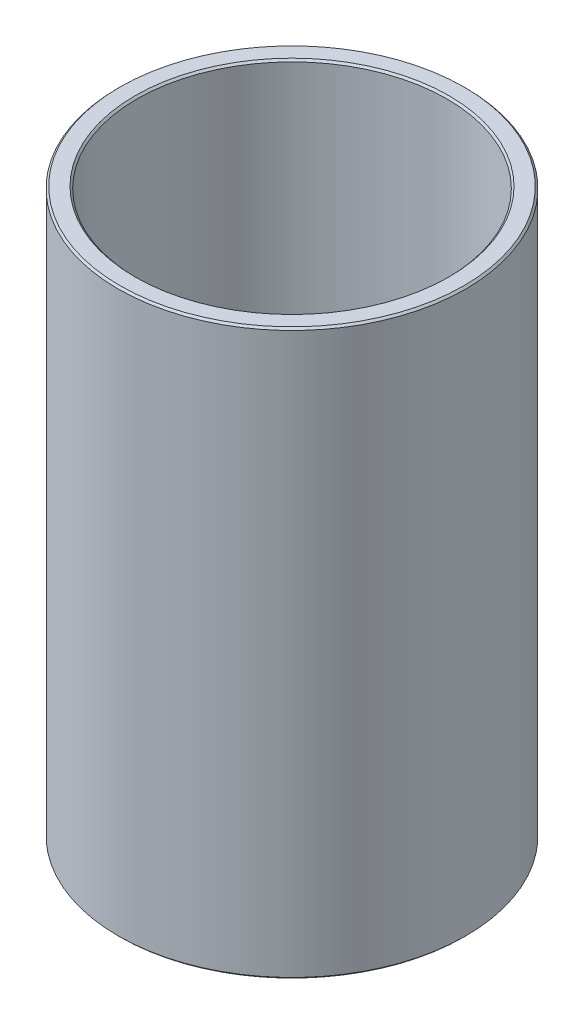
ISO-10303-21;
HEADER;
FILE_DESCRIPTION(('STEP AP214'),'2;1');
FILE_NAME('part.step','',(''),(''),'','','');
FILE_SCHEMA(('AUTOMOTIVE_DESIGN { 1 0 10303 214 1 1 1 1 }'));
ENDSEC;
DATA;
#1=APPLICATION_CONTEXT('core data for automotive mechanical design processes');
#2=APPLICATION_PROTOCOL_DEFINITION('international standard','automotive_design',2000,#1);
#3=PRODUCT_CONTEXT('',#1,'mechanical');
#4=PRODUCT('Part','Part','',(#3));
#5=PRODUCT_RELATED_PRODUCT_CATEGORY('part','',(#4));
#6=PRODUCT_DEFINITION_FORMATION('','',#4);
#7=PRODUCT_DEFINITION_CONTEXT('part definition',#1,'design');
#8=PRODUCT_DEFINITION('design','',#6,#7);
#9=PRODUCT_DEFINITION_SHAPE('','',#8);
#10=(LENGTH_UNIT() NAMED_UNIT(*) SI_UNIT(.MILLI.,.METRE.));
#11=(NAMED_UNIT(*) PLANE_ANGLE_UNIT() SI_UNIT($,.RADIAN.));
#12=(NAMED_UNIT(*) SI_UNIT($,.STERADIAN.) SOLID_ANGLE_UNIT());
#13=UNCERTAINTY_MEASURE_WITH_UNIT(LENGTH_MEASURE(1.E-05),#10,'distance_accuracy_value','');
#14=(GEOMETRIC_REPRESENTATION_CONTEXT(3) GLOBAL_UNCERTAINTY_ASSIGNED_CONTEXT((#13)) GLOBAL_UNIT_ASSIGNED_CONTEXT((#10,
#11,#12)) REPRESENTATION_CONTEXT('',''));
#15=CARTESIAN_POINT('',(0.,0.,0.));
#16=DIRECTION('',(0.,0.,1.));
#17=DIRECTION('',(1.,0.,0.));
#18=AXIS2_PLACEMENT_3D('',#15,#16,#17);
#19=CARTESIAN_POINT('',(16.5,0.,0.));
#20=DIRECTION('',(0.,-1.,0.));
#21=DIRECTION('',(0.,0.,-1.));
#22=AXIS2_PLACEMENT_3D('',#19,#20,#21);
#23=PLANE('',#22);
#24=CARTESIAN_POINT('',(0.,0.,0.));
#25=DIRECTION('',(0.,-1.,0.));
#26=DIRECTION('',(0.,0.,-1.));
#27=AXIS2_PLACEMENT_3D('',#24,#25,#26);
#28=CIRCLE('',#27,16.7);
#29=CARTESIAN_POINT('',(0.,0.,-16.7));
#30=VERTEX_POINT('',#29);
#31=EDGE_CURVE('E79',#30,#30,#28,.F.);
#32=ORIENTED_EDGE('',*,*,#31,.T.);
#33=EDGE_LOOP('',(#32));
#34=FACE_BOUND('',#33,.T.);
#35=CARTESIAN_POINT('',(0.,0.,0.));
#36=DIRECTION('',(0.,-1.,0.));
#37=DIRECTION('',(0.,0.,-1.));
#38=AXIS2_PLACEMENT_3D('',#35,#36,#37);
#39=CIRCLE('',#38,18.3);
#40=CARTESIAN_POINT('',(0.,0.,18.3));
#41=VERTEX_POINT('',#40);
#42=EDGE_CURVE('E83',#41,#41,#39,.T.);
#43=ORIENTED_EDGE('',*,*,#42,.T.);
#44=EDGE_LOOP('',(#43));
#45=FACE_BOUND('',#44,.T.);
#46=ADVANCED_FACE('F51',(#34,#45),#23,.T.);
#47=CARTESIAN_POINT('',(0.,0.,0.));
#48=DIRECTION('',(0.,-1.,0.));
#49=DIRECTION('',(0.,0.,-1.));
#50=AXIS2_PLACEMENT_3D('',#47,#48,#49);
#51=CYLINDRICAL_SURFACE('',#50,18.5);
#52=CARTESIAN_POINT('',(0.,0.199999999999988,0.));
#53=DIRECTION('',(0.,-1.,0.));
#54=DIRECTION('',(0.,0.,-1.));
#55=AXIS2_PLACEMENT_3D('',#52,#53,#54);
#56=CIRCLE('',#55,18.5);
#57=CARTESIAN_POINT('',(0.,0.199999999999988,18.5));
#58=VERTEX_POINT('',#57);
#59=EDGE_CURVE('E67',#58,#58,#56,.F.);
#60=ORIENTED_EDGE('',*,*,#59,.T.);
#61=EDGE_LOOP('',(#60));
#62=FACE_BOUND('',#61,.T.);
#63=CARTESIAN_POINT('',(0.,59.8,0.));
#64=DIRECTION('',(0.,1.,0.));
#65=DIRECTION('',(0.,0.,1.));
#66=AXIS2_PLACEMENT_3D('',#63,#64,#65);
#67=CIRCLE('',#66,18.5);
#68=CARTESIAN_POINT('',(0.,59.8,18.5));
#69=VERTEX_POINT('',#68);
#70=EDGE_CURVE('E74',#69,#69,#67,.F.);
#71=ORIENTED_EDGE('',*,*,#70,.T.);
#72=EDGE_LOOP('',(#71));
#73=FACE_BOUND('',#72,.T.);
#74=ADVANCED_FACE('F111',(#62,#73),#51,.T.);
#75=CARTESIAN_POINT('',(18.5,60.,0.));
#76=DIRECTION('',(0.,1.,0.));
#77=DIRECTION('',(0.,0.,1.));
#78=AXIS2_PLACEMENT_3D('',#75,#76,#77);
#79=PLANE('',#78);
#80=CARTESIAN_POINT('',(0.,60.,0.));
#81=DIRECTION('',(0.,1.,0.));
#82=DIRECTION('',(0.,0.,1.));
#83=AXIS2_PLACEMENT_3D('',#80,#81,#82);
#84=CIRCLE('',#83,16.7);
#85=CARTESIAN_POINT('',(0.,60.,16.7));
#86=VERTEX_POINT('',#85);
#87=EDGE_CURVE('E10',#86,#86,#84,.F.);
#88=ORIENTED_EDGE('',*,*,#87,.T.);
#89=EDGE_LOOP('',(#88));
#90=FACE_BOUND('',#89,.T.);
#91=CARTESIAN_POINT('',(0.,60.,0.));
#92=DIRECTION('',(0.,1.,0.));
#93=DIRECTION('',(0.,0.,1.));
#94=AXIS2_PLACEMENT_3D('',#91,#92,#93);
#95=CIRCLE('',#94,18.3);
#96=CARTESIAN_POINT('',(0.,60.,18.3));
#97=VERTEX_POINT('',#96);
#98=EDGE_CURVE('E60',#97,#97,#95,.T.);
#99=ORIENTED_EDGE('',*,*,#98,.T.);
#100=EDGE_LOOP('',(#99));
#101=FACE_BOUND('',#100,.T.);
#102=ADVANCED_FACE('F117',(#90,#101),#79,.T.);
#103=CARTESIAN_POINT('',(0.,0.,0.));
#104=DIRECTION('',(0.,-1.,0.));
#105=DIRECTION('',(0.,0.,-1.));
#106=AXIS2_PLACEMENT_3D('',#103,#104,#105);
#107=CYLINDRICAL_SURFACE('',#106,16.5);
#108=CARTESIAN_POINT('',(0.,0.200000000000016,0.));
#109=DIRECTION('',(0.,-1.,0.));
#110=DIRECTION('',(0.,0.,-1.));
#111=AXIS2_PLACEMENT_3D('',#108,#109,#110);
#112=CIRCLE('',#111,16.5);
#113=CARTESIAN_POINT('',(0.,0.200000000000016,-16.5));
#114=VERTEX_POINT('',#113);
#115=EDGE_CURVE('E87',#114,#114,#112,.T.);
#116=ORIENTED_EDGE('',*,*,#115,.T.);
#117=EDGE_LOOP('',(#116));
#118=FACE_BOUND('',#117,.T.);
#119=CARTESIAN_POINT('',(0.,59.8,0.));
#120=DIRECTION('',(0.,1.,0.));
#121=DIRECTION('',(0.,0.,1.));
#122=AXIS2_PLACEMENT_3D('',#119,#120,#121);
#123=CIRCLE('',#122,16.5);
#124=CARTESIAN_POINT('',(0.,59.8,16.5));
#125=VERTEX_POINT('',#124);
#126=EDGE_CURVE('E91',#125,#125,#123,.T.);
#127=ORIENTED_EDGE('',*,*,#126,.T.);
#128=EDGE_LOOP('',(#127));
#129=FACE_BOUND('',#128,.T.);
#130=ADVANCED_FACE('F96',(#118,#129),#107,.F.);
#131=CARTESIAN_POINT('',(0.,0.200000000000016,0.));
#132=DIRECTION('',(0.,-1.,0.));
#133=DIRECTION('',(0.,0.,-1.));
#134=AXIS2_PLACEMENT_3D('',#131,#132,#133);
#135=CONICAL_SURFACE('',#134,16.5,0.785398163397448);
#136=CARTESIAN_POINT('',(0.,0.,-16.7));
#137=CARTESIAN_POINT('',(0.,0.00208333333333434,-16.6979166666667));
#138=CARTESIAN_POINT('',(0.,0.00416666666666758,-16.6958333333333));
#139=CARTESIAN_POINT('',(0.,0.00833333333333406,-16.6916666666667));
#140=CARTESIAN_POINT('',(0.,0.0104166666666673,-16.6895833333333));
#141=CARTESIAN_POINT('',(0.,0.0145833333333342,-16.6854166666667));
#142=CARTESIAN_POINT('',(0.,0.0166666666666679,-16.6833333333333));
#143=CARTESIAN_POINT('',(0.,0.0208333333333352,-16.6791666666667));
#144=CARTESIAN_POINT('',(0.,0.0229166666666689,-16.6770833333333));
#145=CARTESIAN_POINT('',(0.,0.0270833333333357,-16.6729166666667));
#146=CARTESIAN_POINT('',(0.,0.0291666666666689,-16.6708333333333));
#147=CARTESIAN_POINT('',(0.,0.0333333333333357,-16.6666666666667));
#148=CARTESIAN_POINT('',(0.,0.0354166666666694,-16.6645833333333));
#149=CARTESIAN_POINT('',(0.,0.0395833333333367,-16.6604166666667));
#150=CARTESIAN_POINT('',(0.,0.0416666666666704,-16.6583333333333));
#151=CARTESIAN_POINT('',(0.,0.0458333333333373,-16.6541666666667));
#152=CARTESIAN_POINT('',(0.,0.0479166666666704,-16.6520833333333));
#153=CARTESIAN_POINT('',(0.,0.0520833333333372,-16.6479166666667));
#154=CARTESIAN_POINT('',(0.,0.0541666666666709,-16.6458333333333));
#155=CARTESIAN_POINT('',(0.,0.0583333333333383,-16.6416666666667));
#156=CARTESIAN_POINT('',(0.,0.060416666666672,-16.6395833333333));
#157=CARTESIAN_POINT('',(0.,0.0645833333333388,-16.6354166666667));
#158=CARTESIAN_POINT('',(0.,0.0666666666666719,-16.6333333333333));
#159=CARTESIAN_POINT('',(0.,0.0708333333333387,-16.6291666666667));
#160=CARTESIAN_POINT('',(0.,0.0729166666666724,-16.6270833333333));
#161=CARTESIAN_POINT('',(0.,0.0770833333333398,-16.6229166666667));
#162=CARTESIAN_POINT('',(0.,0.0791666666666735,-16.6208333333333));
#163=CARTESIAN_POINT('',(0.,0.0833333333333402,-16.6166666666667));
#164=CARTESIAN_POINT('',(0.,0.0854166666666733,-16.6145833333333));
#165=CARTESIAN_POINT('',(0.,0.0895833333333403,-16.6104166666667));
#166=CARTESIAN_POINT('',(0.,0.0916666666666743,-16.6083333333333));
#167=CARTESIAN_POINT('',(0.,0.0958333333333414,-16.6041666666667));
#168=CARTESIAN_POINT('',(0.,0.0979166666666744,-16.6020833333333));
#169=CARTESIAN_POINT('',(0.,0.102083333333341,-16.5979166666667));
#170=CARTESIAN_POINT('',(0.,0.104166666666675,-16.5958333333333));
#171=CARTESIAN_POINT('',(0.,0.108333333333342,-16.5916666666667));
#172=CARTESIAN_POINT('',(0.,0.110416666666676,-16.5895833333333));
#173=CARTESIAN_POINT('',(0.,0.114583333333343,-16.5854166666667));
#174=CARTESIAN_POINT('',(0.,0.116666666666676,-16.5833333333333));
#175=CARTESIAN_POINT('',(0.,0.120833333333343,-16.5791666666667));
#176=CARTESIAN_POINT('',(0.,0.122916666666676,-16.5770833333333));
#177=CARTESIAN_POINT('',(0.,0.127083333333344,-16.5729166666667));
#178=CARTESIAN_POINT('',(0.,0.129166666666678,-16.5708333333333));
#179=CARTESIAN_POINT('',(0.,0.133333333333344,-16.5666666666667));
#180=CARTESIAN_POINT('',(0.,0.135416666666677,-16.5645833333333));
#181=CARTESIAN_POINT('',(0.,0.139583333333344,-16.5604166666667));
#182=CARTESIAN_POINT('',(0.,0.141666666666678,-16.5583333333333));
#183=CARTESIAN_POINT('',(0.,0.145833333333345,-16.5541666666667));
#184=CARTESIAN_POINT('',(0.,0.147916666666679,-16.5520833333333));
#185=CARTESIAN_POINT('',(0.,0.152083333333346,-16.5479166666667));
#186=CARTESIAN_POINT('',(0.,0.154166666666679,-16.5458333333333));
#187=CARTESIAN_POINT('',(0.,0.158333333333346,-16.5416666666667));
#188=CARTESIAN_POINT('',(0.,0.160416666666679,-16.5395833333333));
#189=CARTESIAN_POINT('',(0.,0.164583333333347,-16.5354166666667));
#190=CARTESIAN_POINT('',(0.,0.166666666666681,-16.5333333333333));
#191=CARTESIAN_POINT('',(0.,0.170833333333347,-16.5291666666667));
#192=CARTESIAN_POINT('',(0.,0.17291666666668,-16.5270833333333));
#193=CARTESIAN_POINT('',(0.,0.177083333333347,-16.5229166666667));
#194=CARTESIAN_POINT('',(0.,0.179166666666681,-16.5208333333333));
#195=CARTESIAN_POINT('',(0.,0.183333333333348,-16.5166666666667));
#196=CARTESIAN_POINT('',(0.,0.185416666666682,-16.5145833333333));
#197=CARTESIAN_POINT('',(0.,0.189583333333349,-16.5104166666667));
#198=CARTESIAN_POINT('',(0.,0.191666666666682,-16.5083333333333));
#199=CARTESIAN_POINT('',(0.,0.195833333333349,-16.5041666666667));
#200=CARTESIAN_POINT('',(0.,0.197916666666682,-16.5020833333333));
#201=CARTESIAN_POINT('',(0.,0.200000000000016,-16.5));
#202=B_SPLINE_CURVE_WITH_KNOTS('',3,(#136,#137,#138,#139,#140,#141,#142,#143,#144,#145,#146,
#147,#148,#149,#150,#151,#152,#153,#154,#155,#156,#157,#158,#159,#160,#161,#162,#163,#164,#165,
#166,#167,#168,#169,#170,#171,#172,#173,#174,#175,#176,#177,#178,#179,#180,#181,#182,#183,#184,
#185,#186,#187,#188,#189,#190,#191,#192,#193,#194,#195,#196,#197,#198,#199,#200,#201),
.UNSPECIFIED.,.F.,.F.,(4,2,2,2,2,2,2,2,2,2,2,2,2,2,2,2,2,2,2,2,2,2,2,2,2,2,2,2,2,2,2,2,4),(0.,
0.00883883476483171,0.0176776695296659,0.0265165042944976,0.0353553390593293,0.0441941738241635,
0.0530330085889952,0.0618718433538269,0.0707106781186611,0.0795495128834928,0.0883883476483245,
0.0972271824131587,0.10606601717799,0.114904851942822,0.123743686707656,0.132582521472488,
0.141421356237322,0.150260191002154,0.159099025766986,0.16793786053182,0.176776695296651,
0.185615530061483,0.194454364826317,0.203293199591149,0.212132034355981,0.220970869120815,
0.229809703885647,0.238648538650478,0.247487373415313,0.256326208180144,0.265165042944976,
0.27400387770981,0.282842712474642),.UNSPECIFIED.);
#203=EDGE_CURVE('BSEAM106',#30,#114,#202,.T.);
#204=ORIENTED_EDGE('',*,*,#31,.F.);
#205=ORIENTED_EDGE('',*,*,#115,.F.);
#206=ORIENTED_EDGE('',*,*,#203,.T.);
#207=ORIENTED_EDGE('',*,*,#203,.F.);
#208=EDGE_LOOP('',(#204,#206,#205,#207));
#209=FACE_BOUND('',#208,.T.);
#210=ADVANCED_FACE('F106',(#209),#135,.F.);
#211=CARTESIAN_POINT('',(0.,0.,0.));
#212=DIRECTION('',(0.,1.,0.));
#213=DIRECTION('',(0.,0.,1.));
#214=AXIS2_PLACEMENT_3D('',#211,#212,#213);
#215=CONICAL_SURFACE('',#214,18.3,0.785398163397431);
#216=CARTESIAN_POINT('',(0.,0.199999999999988,18.5));
#217=CARTESIAN_POINT('',(0.,0.197916666666655,18.4979166666667));
#218=CARTESIAN_POINT('',(0.,0.195833333333322,18.4958333333333));
#219=CARTESIAN_POINT('',(0.,0.191666666666656,18.4916666666667));
#220=CARTESIAN_POINT('',(0.,0.189583333333322,18.4895833333333));
#221=CARTESIAN_POINT('',(0.,0.185416666666656,18.4854166666667));
#222=CARTESIAN_POINT('',(0.,0.183333333333323,18.4833333333333));
#223=CARTESIAN_POINT('',(0.,0.179166666666656,18.4791666666667));
#224=CARTESIAN_POINT('',(0.,0.177083333333323,18.4770833333333));
#225=CARTESIAN_POINT('',(0.,0.172916666666657,18.4729166666667));
#226=CARTESIAN_POINT('',(0.,0.170833333333323,18.4708333333333));
#227=CARTESIAN_POINT('',(0.,0.166666666666657,18.4666666666667));
#228=CARTESIAN_POINT('',(0.,0.164583333333324,18.4645833333333));
#229=CARTESIAN_POINT('',(0.,0.160416666666657,18.4604166666667));
#230=CARTESIAN_POINT('',(0.,0.158333333333324,18.4583333333333));
#231=CARTESIAN_POINT('',(0.,0.154166666666658,18.4541666666667));
#232=CARTESIAN_POINT('',(0.,0.152083333333325,18.4520833333333));
#233=CARTESIAN_POINT('',(0.,0.147916666666658,18.4479166666667));
#234=CARTESIAN_POINT('',(0.,0.145833333333325,18.4458333333333));
#235=CARTESIAN_POINT('',(0.,0.141666666666658,18.4416666666667));
#236=CARTESIAN_POINT('',(0.,0.139583333333325,18.4395833333333));
#237=CARTESIAN_POINT('',(0.,0.135416666666659,18.4354166666667));
#238=CARTESIAN_POINT('',(0.,0.133333333333326,18.4333333333333));
#239=CARTESIAN_POINT('',(0.,0.129166666666659,18.4291666666667));
#240=CARTESIAN_POINT('',(0.,0.127083333333326,18.4270833333333));
#241=CARTESIAN_POINT('',(0.,0.12291666666666,18.4229166666667));
#242=CARTESIAN_POINT('',(0.,0.120833333333326,18.4208333333333));
#243=CARTESIAN_POINT('',(0.,0.11666666666666,18.4166666666667));
#244=CARTESIAN_POINT('',(0.,0.114583333333327,18.4145833333333));
#245=CARTESIAN_POINT('',(0.,0.11041666666666,18.4104166666667));
#246=CARTESIAN_POINT('',(0.,0.108333333333327,18.4083333333333));
#247=CARTESIAN_POINT('',(0.,0.104166666666661,18.4041666666667));
#248=CARTESIAN_POINT('',(0.,0.102083333333327,18.4020833333333));
#249=CARTESIAN_POINT('',(0.,0.0979166666666608,18.3979166666667));
#250=CARTESIAN_POINT('',(0.,0.095833333333328,18.3958333333333));
#251=CARTESIAN_POINT('',(0.,0.0916666666666617,18.3916666666667));
#252=CARTESIAN_POINT('',(0.,0.0895833333333282,18.3895833333333));
#253=CARTESIAN_POINT('',(0.,0.0854166666666616,18.3854166666667));
#254=CARTESIAN_POINT('',(0.,0.0833333333333285,18.3833333333333));
#255=CARTESIAN_POINT('',(0.,0.0791666666666621,18.3791666666667));
#256=CARTESIAN_POINT('',(0.,0.0770833333333289,18.3770833333333));
#257=CARTESIAN_POINT('',(0.,0.0729166666666624,18.3729166666667));
#258=CARTESIAN_POINT('',(0.,0.0708333333333292,18.3708333333333));
#259=CARTESIAN_POINT('',(0.,0.0666666666666628,18.3666666666667));
#260=CARTESIAN_POINT('',(0.,0.0645833333333296,18.3645833333333));
#261=CARTESIAN_POINT('',(0.,0.0604166666666632,18.3604166666667));
#262=CARTESIAN_POINT('',(0.,0.05833333333333,18.3583333333333));
#263=CARTESIAN_POINT('',(0.,0.0541666666666635,18.3541666666667));
#264=CARTESIAN_POINT('',(0.,0.0520833333333303,18.3520833333333));
#265=CARTESIAN_POINT('',(0.,0.0479166666666639,18.3479166666667));
#266=CARTESIAN_POINT('',(0.,0.0458333333333307,18.3458333333333));
#267=CARTESIAN_POINT('',(0.,0.0416666666666642,18.3416666666667));
#268=CARTESIAN_POINT('',(0.,0.039583333333331,18.3395833333333));
#269=CARTESIAN_POINT('',(0.,0.0354166666666646,18.3354166666667));
#270=CARTESIAN_POINT('',(0.,0.0333333333333314,18.3333333333333));
#271=CARTESIAN_POINT('',(0.,0.029166666666665,18.3291666666667));
#272=CARTESIAN_POINT('',(0.,0.0270833333333318,18.3270833333333));
#273=CARTESIAN_POINT('',(0.,0.0229166666666653,18.3229166666667));
#274=CARTESIAN_POINT('',(0.,0.0208333333333321,18.3208333333333));
#275=CARTESIAN_POINT('',(0.,0.0166666666666657,18.3166666666667));
#276=CARTESIAN_POINT('',(0.,0.0145833333333325,18.3145833333333));
#277=CARTESIAN_POINT('',(0.,0.0104166666666661,18.3104166666667));
#278=CARTESIAN_POINT('',(0.,0.00833333333333285,18.3083333333334));
#279=CARTESIAN_POINT('',(0.,0.00416666666666642,18.3041666666667));
#280=CARTESIAN_POINT('',(0.,0.00208333333333321,18.3020833333333));
#281=CARTESIAN_POINT('',(0.,0.,18.3));
#282=B_SPLINE_CURVE_WITH_KNOTS('',3,(#216,#217,#218,#219,#220,#221,#222,#223,#224,#225,#226,
#227,#228,#229,#230,#231,#232,#233,#234,#235,#236,#237,#238,#239,#240,#241,#242,#243,#244,#245,
#246,#247,#248,#249,#250,#251,#252,#253,#254,#255,#256,#257,#258,#259,#260,#261,#262,#263,#264,
#265,#266,#267,#268,#269,#270,#271,#272,#273,#274,#275,#276,#277,#278,#279,#280,#281),
.UNSPECIFIED.,.F.,.F.,(4,2,2,2,2,2,2,2,2,2,2,2,2,2,2,2,2,2,2,2,2,2,2,2,2,2,2,2,2,2,2,2,4),(0.,
0.0088388347648311,0.0176776695296622,0.0265165042944933,0.0353553390593244,0.0441941738241555,
0.0530330085889866,0.0618718433538177,0.0707106781186488,0.0795495128834799,0.088388347648311,
0.0972271824131421,0.106066017177973,0.114904851942804,0.123743686707635,0.132582521472466,
0.141421356237298,0.150260191002131,0.159099025766962,0.167937860531793,0.176776695296624,
0.185615530061456,0.194454364826287,0.203293199591118,0.212132034355949,0.22097086912078,
0.229809703885611,0.238648538650442,0.247487373415273,0.256326208180104,0.265165042944935,
0.274003877709767,0.282842712474598),.UNSPECIFIED.);
#283=EDGE_CURVE('BSEAM101',#58,#41,#282,.T.);
#284=ORIENTED_EDGE('',*,*,#59,.F.);
#285=ORIENTED_EDGE('',*,*,#42,.F.);
#286=ORIENTED_EDGE('',*,*,#283,.T.);
#287=ORIENTED_EDGE('',*,*,#283,.F.);
#288=EDGE_LOOP('',(#284,#286,#285,#287));
#289=FACE_BOUND('',#288,.T.);
#290=ADVANCED_FACE('F101',(#289),#215,.T.);
#291=CARTESIAN_POINT('',(0.,60.,0.));
#292=DIRECTION('',(0.,1.,0.));
#293=DIRECTION('',(0.,0.,1.));
#294=AXIS2_PLACEMENT_3D('',#291,#292,#293);
#295=CONICAL_SURFACE('',#294,16.7,0.785398163397457);
#296=ORIENTED_EDGE('',*,*,#126,.F.);
#297=EDGE_LOOP('',(#296));
#298=FACE_BOUND('',#297,.T.);
#299=ORIENTED_EDGE('',*,*,#87,.F.);
#300=EDGE_LOOP('',(#299));
#301=FACE_BOUND('',#300,.T.);
#302=ADVANCED_FACE('F98',(#298,#301),#295,.F.);
#303=CARTESIAN_POINT('',(0.,59.8,0.));
#304=DIRECTION('',(0.,-1.,0.));
#305=DIRECTION('',(0.,0.,-1.));
#306=AXIS2_PLACEMENT_3D('',#303,#304,#305);
#307=CONICAL_SURFACE('',#306,18.5,0.78539816339744);
#308=ORIENTED_EDGE('',*,*,#98,.F.);
#309=EDGE_LOOP('',(#308));
#310=FACE_BOUND('',#309,.T.);
#311=ORIENTED_EDGE('',*,*,#70,.F.);
#312=EDGE_LOOP('',(#311));
#313=FACE_BOUND('',#312,.T.);
#314=ADVANCED_FACE('F54',(#310,#313),#307,.T.);
#315=CLOSED_SHELL('',(#46,#74,#102,#130,#210,#290,#302,#314));
#316=MANIFOLD_SOLID_BREP('B2',#315);
#317=ADVANCED_BREP_SHAPE_REPRESENTATION('',(#18,#316),#14);
#318=SHAPE_DEFINITION_REPRESENTATION(#9,#317);
ENDSEC;
END-ISO-10303-21;
